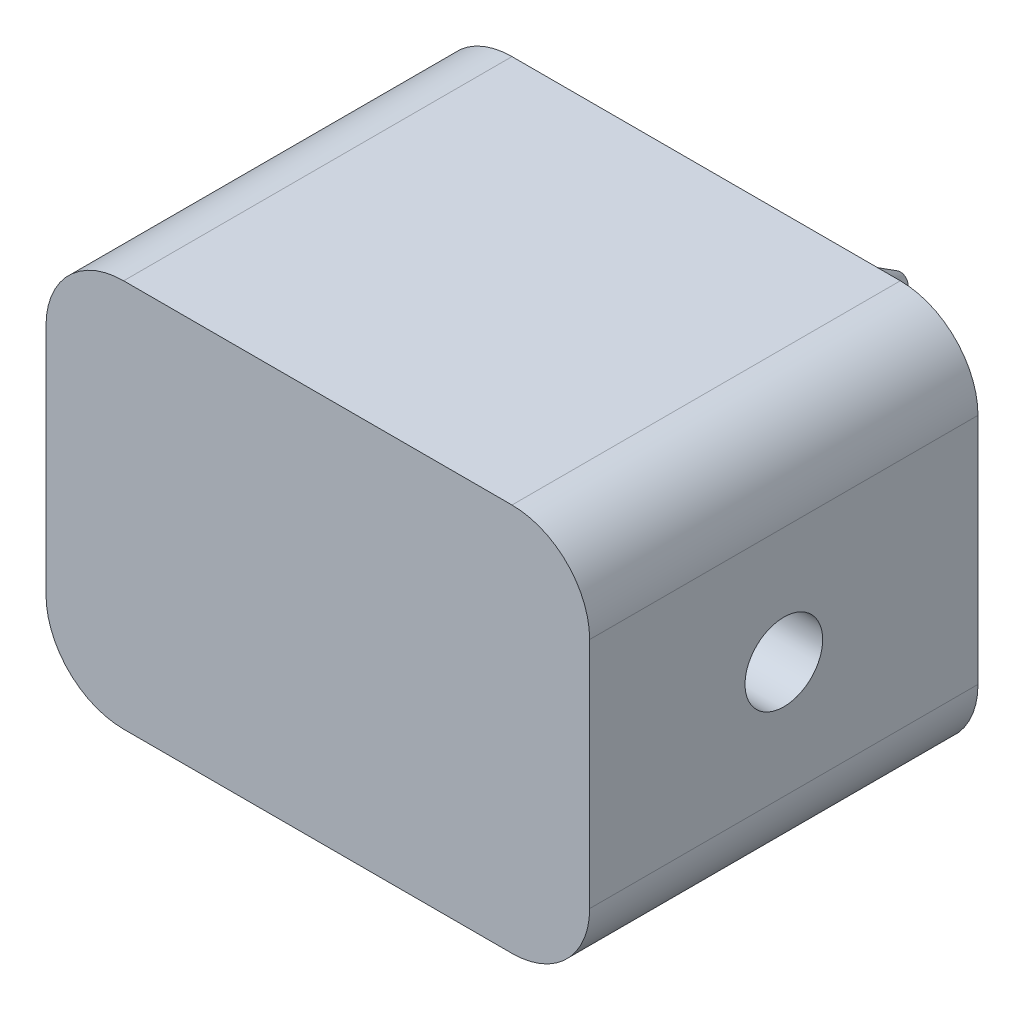
ISO-10303-21;
HEADER;
FILE_DESCRIPTION(('STEP AP214'),'2;1');
FILE_NAME('part.step','',(''),(''),'','','');
FILE_SCHEMA(('AUTOMOTIVE_DESIGN { 1 0 10303 214 1 1 1 1 }'));
ENDSEC;
DATA;
#1=APPLICATION_CONTEXT('core data for automotive mechanical design processes');
#2=APPLICATION_PROTOCOL_DEFINITION('international standard','automotive_design',2000,#1);
#3=PRODUCT_CONTEXT('',#1,'mechanical');
#4=PRODUCT('Part','Part','',(#3));
#5=PRODUCT_RELATED_PRODUCT_CATEGORY('part','',(#4));
#6=PRODUCT_DEFINITION_FORMATION('','',#4);
#7=PRODUCT_DEFINITION_CONTEXT('part definition',#1,'design');
#8=PRODUCT_DEFINITION('design','',#6,#7);
#9=PRODUCT_DEFINITION_SHAPE('','',#8);
#10=(LENGTH_UNIT() NAMED_UNIT(*) SI_UNIT(.MILLI.,.METRE.));
#11=(NAMED_UNIT(*) PLANE_ANGLE_UNIT() SI_UNIT($,.RADIAN.));
#12=(NAMED_UNIT(*) SI_UNIT($,.STERADIAN.) SOLID_ANGLE_UNIT());
#13=UNCERTAINTY_MEASURE_WITH_UNIT(LENGTH_MEASURE(1.E-05),#10,'distance_accuracy_value','');
#14=(GEOMETRIC_REPRESENTATION_CONTEXT(3) GLOBAL_UNCERTAINTY_ASSIGNED_CONTEXT((#13)) GLOBAL_UNIT_ASSIGNED_CONTEXT((#10,
#11,#12)) REPRESENTATION_CONTEXT('',''));
#15=CARTESIAN_POINT('',(0.,0.,0.));
#16=DIRECTION('',(0.,0.,1.));
#17=DIRECTION('',(1.,0.,0.));
#18=AXIS2_PLACEMENT_3D('',#15,#16,#17);
#19=CARTESIAN_POINT('',(0.,0.,50.));
#20=DIRECTION('',(1.,0.,0.));
#21=DIRECTION('',(0.,0.,-1.));
#22=AXIS2_PLACEMENT_3D('',#19,#20,#21);
#23=PLANE('',#22);
#24=CARTESIAN_POINT('',(0.,25.,25.));
#25=DIRECTION('',(1.,0.,0.));
#26=DIRECTION('',(0.,0.,-1.));
#27=AXIS2_PLACEMENT_3D('',#24,#25,#26);
#28=CIRCLE('',#27,5.);
#29=CARTESIAN_POINT('',(0.,25.,20.));
#30=VERTEX_POINT('',#29);
#31=EDGE_CURVE('E134',#30,#30,#28,.T.);
#32=ORIENTED_EDGE('',*,*,#31,.T.);
#33=EDGE_LOOP('',(#32));
#34=FACE_BOUND('',#33,.T.);
#35=DIRECTION('',(0.,-1.,0.));
#36=VECTOR('',#35,1.);
#37=CARTESIAN_POINT('',(0.,0.,0.));
#38=LINE('',#37,#36);
#39=CARTESIAN_POINT('',(0.,40.,0.));
#40=VERTEX_POINT('',#39);
#41=CARTESIAN_POINT('',(0.,10.,0.));
#42=VERTEX_POINT('',#41);
#43=EDGE_CURVE('E129',#40,#42,#38,.T.);
#44=ORIENTED_EDGE('',*,*,#43,.T.);
#45=DIRECTION('',(0.,0.,-1.));
#46=VECTOR('',#45,1.);
#47=CARTESIAN_POINT('',(0.,10.,50.));
#48=LINE('',#47,#46);
#49=CARTESIAN_POINT('',(0.,10.,50.));
#50=VERTEX_POINT('',#49);
#51=EDGE_CURVE('E106',#42,#50,#48,.F.);
#52=ORIENTED_EDGE('',*,*,#51,.T.);
#53=DIRECTION('',(0.,-1.,0.));
#54=VECTOR('',#53,1.);
#55=CARTESIAN_POINT('',(0.,0.,50.));
#56=LINE('',#55,#54);
#57=CARTESIAN_POINT('',(0.,40.,50.));
#58=VERTEX_POINT('',#57);
#59=EDGE_CURVE('E139',#58,#50,#56,.T.);
#60=ORIENTED_EDGE('',*,*,#59,.F.);
#61=DIRECTION('',(0.,0.,-1.));
#62=VECTOR('',#61,1.);
#63=CARTESIAN_POINT('',(0.,40.,50.));
#64=LINE('',#63,#62);
#65=EDGE_CURVE('E111',#58,#40,#64,.T.);
#66=ORIENTED_EDGE('',*,*,#65,.T.);
#67=EDGE_LOOP('',(#44,#52,#60,#66));
#68=FACE_BOUND('',#67,.T.);
#69=ADVANCED_FACE('F34',(#34,#68),#23,.F.);
#70=CARTESIAN_POINT('',(0.,0.,50.));
#71=DIRECTION('',(0.,1.,0.));
#72=DIRECTION('',(0.,0.,1.));
#73=AXIS2_PLACEMENT_3D('',#70,#71,#72);
#74=PLANE('',#73);
#75=DIRECTION('',(1.,0.,0.));
#76=VECTOR('',#75,1.);
#77=CARTESIAN_POINT('',(0.,0.,50.));
#78=LINE('',#77,#76);
#79=CARTESIAN_POINT('',(10.,0.,50.));
#80=VERTEX_POINT('',#79);
#81=CARTESIAN_POINT('',(60.,0.,50.));
#82=VERTEX_POINT('',#81);
#83=EDGE_CURVE('E121',#80,#82,#78,.T.);
#84=ORIENTED_EDGE('',*,*,#83,.F.);
#85=DIRECTION('',(0.,0.,-1.));
#86=VECTOR('',#85,1.);
#87=CARTESIAN_POINT('',(10.,0.,50.));
#88=LINE('',#87,#86);
#89=CARTESIAN_POINT('',(10.,0.,0.));
#90=VERTEX_POINT('',#89);
#91=EDGE_CURVE('E105',#80,#90,#88,.T.);
#92=ORIENTED_EDGE('',*,*,#91,.T.);
#93=DIRECTION('',(1.,0.,0.));
#94=VECTOR('',#93,1.);
#95=CARTESIAN_POINT('',(0.,0.,0.));
#96=LINE('',#95,#94);
#97=CARTESIAN_POINT('',(60.,0.,0.));
#98=VERTEX_POINT('',#97);
#99=EDGE_CURVE('E118',#90,#98,#96,.T.);
#100=ORIENTED_EDGE('',*,*,#99,.T.);
#101=DIRECTION('',(0.,0.,-1.));
#102=VECTOR('',#101,1.);
#103=CARTESIAN_POINT('',(60.,0.,50.));
#104=LINE('',#103,#102);
#105=EDGE_CURVE('E123',#98,#82,#104,.F.);
#106=ORIENTED_EDGE('',*,*,#105,.T.);
#107=EDGE_LOOP('',(#84,#92,#100,#106));
#108=FACE_BOUND('',#107,.T.);
#109=ADVANCED_FACE('F117',(#108),#74,.F.);
#110=CARTESIAN_POINT('',(70.,0.,50.));
#111=DIRECTION('',(-1.,0.,0.));
#112=DIRECTION('',(0.,0.,1.));
#113=AXIS2_PLACEMENT_3D('',#110,#111,#112);
#114=PLANE('',#113);
#115=CARTESIAN_POINT('',(70.,25.,25.));
#116=DIRECTION('',(1.,0.,0.));
#117=DIRECTION('',(0.,0.,-1.));
#118=AXIS2_PLACEMENT_3D('',#115,#116,#117);
#119=CIRCLE('',#118,5.);
#120=CARTESIAN_POINT('',(70.,25.,20.));
#121=VERTEX_POINT('',#120);
#122=EDGE_CURVE('E188',#121,#121,#119,.T.);
#123=ORIENTED_EDGE('',*,*,#122,.F.);
#124=EDGE_LOOP('',(#123));
#125=FACE_BOUND('',#124,.T.);
#126=DIRECTION('',(0.,1.,0.));
#127=VECTOR('',#126,1.);
#128=CARTESIAN_POINT('',(70.,0.,50.));
#129=LINE('',#128,#127);
#130=CARTESIAN_POINT('',(70.,10.,50.));
#131=VERTEX_POINT('',#130);
#132=CARTESIAN_POINT('',(70.,40.,50.));
#133=VERTEX_POINT('',#132);
#134=EDGE_CURVE('E168',#131,#133,#129,.T.);
#135=ORIENTED_EDGE('',*,*,#134,.F.);
#136=DIRECTION('',(0.,0.,-1.));
#137=VECTOR('',#136,1.);
#138=CARTESIAN_POINT('',(70.,10.,50.));
#139=LINE('',#138,#137);
#140=CARTESIAN_POINT('',(70.,10.,0.));
#141=VERTEX_POINT('',#140);
#142=EDGE_CURVE('E11',#131,#141,#139,.T.);
#143=ORIENTED_EDGE('',*,*,#142,.T.);
#144=DIRECTION('',(0.,1.,0.));
#145=VECTOR('',#144,1.);
#146=CARTESIAN_POINT('',(70.,0.,0.));
#147=LINE('',#146,#145);
#148=CARTESIAN_POINT('',(70.,40.,0.));
#149=VERTEX_POINT('',#148);
#150=EDGE_CURVE('E128',#141,#149,#147,.T.);
#151=ORIENTED_EDGE('',*,*,#150,.T.);
#152=DIRECTION('',(0.,0.,-1.));
#153=VECTOR('',#152,1.);
#154=CARTESIAN_POINT('',(70.,40.,50.));
#155=LINE('',#154,#153);
#156=EDGE_CURVE('E42',#149,#133,#155,.F.);
#157=ORIENTED_EDGE('',*,*,#156,.T.);
#158=EDGE_LOOP('',(#135,#143,#151,#157));
#159=FACE_BOUND('',#158,.T.);
#160=ADVANCED_FACE('F167',(#125,#159),#114,.F.);
#161=CARTESIAN_POINT('',(0.,50.,50.));
#162=DIRECTION('',(0.,-1.,0.));
#163=DIRECTION('',(0.,0.,-1.));
#164=AXIS2_PLACEMENT_3D('',#161,#162,#163);
#165=PLANE('',#164);
#166=DIRECTION('',(-1.,0.,0.));
#167=VECTOR('',#166,1.);
#168=CARTESIAN_POINT('',(0.,50.,0.));
#169=LINE('',#168,#167);
#170=CARTESIAN_POINT('',(60.,50.,0.));
#171=VERTEX_POINT('',#170);
#172=CARTESIAN_POINT('',(10.,50.,0.));
#173=VERTEX_POINT('',#172);
#174=EDGE_CURVE('E132',#171,#173,#169,.T.);
#175=ORIENTED_EDGE('',*,*,#174,.T.);
#176=DIRECTION('',(0.,0.,-1.));
#177=VECTOR('',#176,1.);
#178=CARTESIAN_POINT('',(10.,50.,50.));
#179=LINE('',#178,#177);
#180=CARTESIAN_POINT('',(10.,50.,50.));
#181=VERTEX_POINT('',#180);
#182=EDGE_CURVE('E49',#173,#181,#179,.F.);
#183=ORIENTED_EDGE('',*,*,#182,.T.);
#184=DIRECTION('',(-1.,0.,0.));
#185=VECTOR('',#184,1.);
#186=CARTESIAN_POINT('',(0.,50.,50.));
#187=LINE('',#186,#185);
#188=CARTESIAN_POINT('',(60.,50.,50.));
#189=VERTEX_POINT('',#188);
#190=EDGE_CURVE('E174',#189,#181,#187,.T.);
#191=ORIENTED_EDGE('',*,*,#190,.F.);
#192=DIRECTION('',(0.,0.,-1.));
#193=VECTOR('',#192,1.);
#194=CARTESIAN_POINT('',(60.,50.,50.));
#195=LINE('',#194,#193);
#196=EDGE_CURVE('E161',#189,#171,#195,.T.);
#197=ORIENTED_EDGE('',*,*,#196,.T.);
#198=EDGE_LOOP('',(#175,#183,#191,#197));
#199=FACE_BOUND('',#198,.T.);
#200=ADVANCED_FACE('F178',(#199),#165,.F.);
#201=CARTESIAN_POINT('',(0.,0.,50.));
#202=DIRECTION('',(0.,0.,-1.));
#203=DIRECTION('',(-1.,0.,0.));
#204=AXIS2_PLACEMENT_3D('',#201,#202,#203);
#205=PLANE('',#204);
#206=ORIENTED_EDGE('',*,*,#59,.T.);
#207=CARTESIAN_POINT('',(10.,10.,50.));
#208=DIRECTION('',(0.,0.,-1.));
#209=DIRECTION('',(-1.,0.,0.));
#210=AXIS2_PLACEMENT_3D('',#207,#208,#209);
#211=CIRCLE('',#210,10.);
#212=EDGE_CURVE('E159',#50,#80,#211,.F.);
#213=ORIENTED_EDGE('',*,*,#212,.T.);
#214=ORIENTED_EDGE('',*,*,#83,.T.);
#215=CARTESIAN_POINT('',(60.,10.,50.));
#216=DIRECTION('',(0.,0.,-1.));
#217=DIRECTION('',(-1.,0.,0.));
#218=AXIS2_PLACEMENT_3D('',#215,#216,#217);
#219=CIRCLE('',#218,10.);
#220=EDGE_CURVE('E155',#82,#131,#219,.F.);
#221=ORIENTED_EDGE('',*,*,#220,.T.);
#222=ORIENTED_EDGE('',*,*,#134,.T.);
#223=CARTESIAN_POINT('',(60.,40.,50.));
#224=DIRECTION('',(0.,0.,-1.));
#225=DIRECTION('',(-1.,0.,0.));
#226=AXIS2_PLACEMENT_3D('',#223,#224,#225);
#227=CIRCLE('',#226,10.);
#228=EDGE_CURVE('E56',#133,#189,#227,.F.);
#229=ORIENTED_EDGE('',*,*,#228,.T.);
#230=ORIENTED_EDGE('',*,*,#190,.T.);
#231=CARTESIAN_POINT('',(10.,40.,50.));
#232=DIRECTION('',(0.,0.,-1.));
#233=DIRECTION('',(-1.,0.,0.));
#234=AXIS2_PLACEMENT_3D('',#231,#232,#233);
#235=CIRCLE('',#234,10.);
#236=EDGE_CURVE('E157',#181,#58,#235,.F.);
#237=ORIENTED_EDGE('',*,*,#236,.T.);
#238=EDGE_LOOP('',(#206,#213,#214,#221,#222,#229,#230,#237));
#239=FACE_BOUND('',#238,.T.);
#240=ADVANCED_FACE('F172',(#239),#205,.F.);
#241=CARTESIAN_POINT('',(0.,0.,0.));
#242=DIRECTION('',(0.,0.,-1.));
#243=DIRECTION('',(-1.,0.,0.));
#244=AXIS2_PLACEMENT_3D('',#241,#242,#243);
#245=PLANE('',#244);
#246=CARTESIAN_POINT('',(35.,25.,0.));
#247=DIRECTION('',(0.,0.,-1.));
#248=DIRECTION('',(-1.,0.,0.));
#249=AXIS2_PLACEMENT_3D('',#246,#247,#248);
#250=CIRCLE('',#249,15.);
#251=CARTESIAN_POINT('',(20.,25.,0.));
#252=VERTEX_POINT('',#251);
#253=EDGE_CURVE('E144',#252,#252,#250,.T.);
#254=ORIENTED_EDGE('',*,*,#253,.F.);
#255=EDGE_LOOP('',(#254));
#256=FACE_BOUND('',#255,.T.);
#257=ORIENTED_EDGE('',*,*,#99,.F.);
#258=CARTESIAN_POINT('',(10.,10.,0.));
#259=DIRECTION('',(0.,0.,-1.));
#260=DIRECTION('',(-1.,0.,0.));
#261=AXIS2_PLACEMENT_3D('',#258,#259,#260);
#262=CIRCLE('',#261,10.);
#263=EDGE_CURVE('E101',#90,#42,#262,.T.);
#264=ORIENTED_EDGE('',*,*,#263,.T.);
#265=ORIENTED_EDGE('',*,*,#43,.F.);
#266=CARTESIAN_POINT('',(10.,40.,0.));
#267=DIRECTION('',(0.,0.,-1.));
#268=DIRECTION('',(-1.,0.,0.));
#269=AXIS2_PLACEMENT_3D('',#266,#267,#268);
#270=CIRCLE('',#269,10.);
#271=EDGE_CURVE('E112',#40,#173,#270,.T.);
#272=ORIENTED_EDGE('',*,*,#271,.T.);
#273=ORIENTED_EDGE('',*,*,#174,.F.);
#274=CARTESIAN_POINT('',(60.,40.,0.));
#275=DIRECTION('',(0.,0.,-1.));
#276=DIRECTION('',(-1.,0.,0.));
#277=AXIS2_PLACEMENT_3D('',#274,#275,#276);
#278=CIRCLE('',#277,10.);
#279=EDGE_CURVE('E122',#171,#149,#278,.T.);
#280=ORIENTED_EDGE('',*,*,#279,.T.);
#281=ORIENTED_EDGE('',*,*,#150,.F.);
#282=CARTESIAN_POINT('',(60.,10.,0.));
#283=DIRECTION('',(0.,0.,-1.));
#284=DIRECTION('',(-1.,0.,0.));
#285=AXIS2_PLACEMENT_3D('',#282,#283,#284);
#286=CIRCLE('',#285,10.);
#287=EDGE_CURVE('E127',#141,#98,#286,.T.);
#288=ORIENTED_EDGE('',*,*,#287,.T.);
#289=EDGE_LOOP('',(#257,#264,#265,#272,#273,#280,#281,#288));
#290=FACE_BOUND('',#289,.T.);
#291=ADVANCED_FACE('F125',(#256,#290),#245,.T.);
#292=CARTESIAN_POINT('',(0.,25.,25.));
#293=DIRECTION('',(1.,0.,0.));
#294=DIRECTION('',(0.,0.,-1.));
#295=AXIS2_PLACEMENT_3D('',#292,#293,#294);
#296=CYLINDRICAL_SURFACE('',#295,5.);
#297=ORIENTED_EDGE('',*,*,#31,.F.);
#298=EDGE_LOOP('',(#297));
#299=FACE_BOUND('',#298,.T.);
#300=ORIENTED_EDGE('',*,*,#122,.T.);
#301=EDGE_LOOP('',(#300));
#302=FACE_BOUND('',#301,.T.);
#303=ADVANCED_FACE('F270',(#299,#302),#296,.F.);
#304=CARTESIAN_POINT('',(35.,25.,-10.));
#305=DIRECTION('',(0.,0.,1.));
#306=DIRECTION('',(1.,0.,0.));
#307=AXIS2_PLACEMENT_3D('',#304,#305,#306);
#308=CYLINDRICAL_SURFACE('',#307,15.);
#309=CARTESIAN_POINT('',(35.,25.,-7.));
#310=DIRECTION('',(0.,0.,-1.));
#311=DIRECTION('',(-1.,0.,0.));
#312=AXIS2_PLACEMENT_3D('',#309,#310,#311);
#313=CIRCLE('',#312,15.);
#314=CARTESIAN_POINT('',(20.,25.,-7.));
#315=VERTEX_POINT('',#314);
#316=EDGE_CURVE('E143',#315,#315,#313,.F.);
#317=ORIENTED_EDGE('',*,*,#316,.T.);
#318=EDGE_LOOP('',(#317));
#319=FACE_BOUND('',#318,.T.);
#320=ORIENTED_EDGE('',*,*,#253,.T.);
#321=EDGE_LOOP('',(#320));
#322=FACE_BOUND('',#321,.T.);
#323=ADVANCED_FACE('F322',(#319,#322),#308,.T.);
#324=CARTESIAN_POINT('',(35.,25.,-10.));
#325=DIRECTION('',(0.,0.,-1.));
#326=DIRECTION('',(-1.,0.,0.));
#327=AXIS2_PLACEMENT_3D('',#324,#325,#326);
#328=PLANE('',#327);
#329=CARTESIAN_POINT('',(35.,25.,-10.));
#330=DIRECTION('',(0.,0.,-1.));
#331=DIRECTION('',(-1.,0.,0.));
#332=AXIS2_PLACEMENT_3D('',#329,#330,#331);
#333=CIRCLE('',#332,12.);
#334=CARTESIAN_POINT('',(23.,25.,-10.));
#335=VERTEX_POINT('',#334);
#336=EDGE_CURVE('E140',#335,#335,#333,.T.);
#337=ORIENTED_EDGE('',*,*,#336,.T.);
#338=EDGE_LOOP('',(#337));
#339=FACE_BOUND('',#338,.T.);
#340=CARTESIAN_POINT('',(35.,25.,-10.));
#341=DIRECTION('',(0.,0.,1.));
#342=DIRECTION('',(1.,0.,0.));
#343=AXIS2_PLACEMENT_3D('',#340,#341,#342);
#344=CIRCLE('',#343,10.);
#345=CARTESIAN_POINT('',(45.,25.,-10.));
#346=VERTEX_POINT('',#345);
#347=EDGE_CURVE('E204',#346,#346,#344,.T.);
#348=ORIENTED_EDGE('',*,*,#347,.T.);
#349=EDGE_LOOP('',(#348));
#350=FACE_BOUND('',#349,.T.);
#351=ADVANCED_FACE('F210',(#339,#350),#328,.T.);
#352=CARTESIAN_POINT('',(35.,25.,-25.));
#353=DIRECTION('',(0.,0.,1.));
#354=DIRECTION('',(1.,0.,0.));
#355=AXIS2_PLACEMENT_3D('',#352,#353,#354);
#356=PLANE('',#355);
#357=CARTESIAN_POINT('',(35.,25.,-25.));
#358=DIRECTION('',(0.,0.,1.));
#359=DIRECTION('',(1.,0.,0.));
#360=AXIS2_PLACEMENT_3D('',#357,#358,#359);
#361=CIRCLE('',#360,1.);
#362=CARTESIAN_POINT('',(36.,25.,-25.));
#363=VERTEX_POINT('',#362);
#364=EDGE_CURVE('E195',#363,#363,#361,.T.);
#365=ORIENTED_EDGE('',*,*,#364,.F.);
#366=EDGE_LOOP('',(#365));
#367=FACE_BOUND('',#366,.T.);
#368=ADVANCED_FACE('F215',(#367),#356,.F.);
#369=CARTESIAN_POINT('',(35.,25.,-25.));
#370=DIRECTION('',(0.,0.,1.));
#371=DIRECTION('',(1.,0.,0.));
#372=AXIS2_PLACEMENT_3D('',#369,#370,#371);
#373=CONICAL_SURFACE('',#372,1.,0.540419500270584);
#374=CARTESIAN_POINT('',(45.,25.,-10.));
#375=CARTESIAN_POINT('',(44.90625,25.,-10.15625));
#376=CARTESIAN_POINT('',(44.8125,25.,-10.3125));
#377=CARTESIAN_POINT('',(44.625,25.,-10.625));
#378=CARTESIAN_POINT('',(44.53125,25.,-10.78125));
#379=CARTESIAN_POINT('',(44.34375,25.,-11.09375));
#380=CARTESIAN_POINT('',(44.25,25.,-11.25));
#381=CARTESIAN_POINT('',(44.0625,25.,-11.5625));
#382=CARTESIAN_POINT('',(43.96875,25.,-11.71875));
#383=CARTESIAN_POINT('',(43.78125,25.,-12.03125));
#384=CARTESIAN_POINT('',(43.6875,25.,-12.1875));
#385=CARTESIAN_POINT('',(43.5,25.,-12.5));
#386=CARTESIAN_POINT('',(43.40625,25.,-12.65625));
#387=CARTESIAN_POINT('',(43.21875,25.,-12.96875));
#388=CARTESIAN_POINT('',(43.125,25.,-13.125));
#389=CARTESIAN_POINT('',(42.9375,25.,-13.4375));
#390=CARTESIAN_POINT('',(42.84375,25.,-13.59375));
#391=CARTESIAN_POINT('',(42.65625,25.,-13.90625));
#392=CARTESIAN_POINT('',(42.5625,25.,-14.0625));
#393=CARTESIAN_POINT('',(42.375,25.,-14.375));
#394=CARTESIAN_POINT('',(42.28125,25.,-14.53125));
#395=CARTESIAN_POINT('',(42.09375,25.,-14.84375));
#396=CARTESIAN_POINT('',(42.,25.,-15.));
#397=CARTESIAN_POINT('',(41.8125,25.,-15.3125));
#398=CARTESIAN_POINT('',(41.71875,25.,-15.46875));
#399=CARTESIAN_POINT('',(41.53125,25.,-15.78125));
#400=CARTESIAN_POINT('',(41.4375,25.,-15.9375));
#401=CARTESIAN_POINT('',(41.25,25.,-16.25));
#402=CARTESIAN_POINT('',(41.15625,25.,-16.40625));
#403=CARTESIAN_POINT('',(40.96875,25.,-16.71875));
#404=CARTESIAN_POINT('',(40.875,25.,-16.875));
#405=CARTESIAN_POINT('',(40.6875,25.,-17.1875));
#406=CARTESIAN_POINT('',(40.59375,25.,-17.34375));
#407=CARTESIAN_POINT('',(40.40625,25.,-17.65625));
#408=CARTESIAN_POINT('',(40.3125,25.,-17.8125));
#409=CARTESIAN_POINT('',(40.125,25.,-18.125));
#410=CARTESIAN_POINT('',(40.03125,25.,-18.28125));
#411=CARTESIAN_POINT('',(39.84375,25.,-18.59375));
#412=CARTESIAN_POINT('',(39.75,25.,-18.75));
#413=CARTESIAN_POINT('',(39.5625,25.,-19.0625));
#414=CARTESIAN_POINT('',(39.46875,25.,-19.21875));
#415=CARTESIAN_POINT('',(39.28125,25.,-19.53125));
#416=CARTESIAN_POINT('',(39.1875,25.,-19.6875));
#417=CARTESIAN_POINT('',(39.,25.,-20.));
#418=CARTESIAN_POINT('',(38.90625,25.,-20.15625));
#419=CARTESIAN_POINT('',(38.71875,25.,-20.46875));
#420=CARTESIAN_POINT('',(38.625,25.,-20.625));
#421=CARTESIAN_POINT('',(38.4375,25.,-20.9375));
#422=CARTESIAN_POINT('',(38.34375,25.,-21.09375));
#423=CARTESIAN_POINT('',(38.15625,25.,-21.40625));
#424=CARTESIAN_POINT('',(38.0625,25.,-21.5625));
#425=CARTESIAN_POINT('',(37.875,25.,-21.875));
#426=CARTESIAN_POINT('',(37.78125,25.,-22.03125));
#427=CARTESIAN_POINT('',(37.59375,25.,-22.34375));
#428=CARTESIAN_POINT('',(37.5,25.,-22.5));
#429=CARTESIAN_POINT('',(37.3125,25.,-22.8125));
#430=CARTESIAN_POINT('',(37.21875,25.,-22.96875));
#431=CARTESIAN_POINT('',(37.03125,25.,-23.28125));
#432=CARTESIAN_POINT('',(36.9375,25.,-23.4375));
#433=CARTESIAN_POINT('',(36.75,25.,-23.75));
#434=CARTESIAN_POINT('',(36.65625,25.,-23.90625));
#435=CARTESIAN_POINT('',(36.46875,25.,-24.21875));
#436=CARTESIAN_POINT('',(36.375,25.,-24.375));
#437=CARTESIAN_POINT('',(36.1875,25.,-24.6875));
#438=CARTESIAN_POINT('',(36.09375,25.,-24.84375));
#439=CARTESIAN_POINT('',(36.,25.,-25.));
#440=B_SPLINE_CURVE_WITH_KNOTS('',3,(#374,#375,#376,#377,#378,#379,#380,#381,#382,#383,#384,
#385,#386,#387,#388,#389,#390,#391,#392,#393,#394,#395,#396,#397,#398,#399,#400,#401,#402,#403,
#404,#405,#406,#407,#408,#409,#410,#411,#412,#413,#414,#415,#416,#417,#418,#419,#420,#421,#422,
#423,#424,#425,#426,#427,#428,#429,#430,#431,#432,#433,#434,#435,#436,#437,#438,#439),
.UNSPECIFIED.,.F.,.F.,(4,2,2,2,2,2,2,2,2,2,2,2,2,2,2,2,2,2,2,2,2,2,2,2,2,2,2,2,2,2,2,2,4),(0.,
0.546651740141749,1.09330348028349,1.63995522042524,2.18660696056699,2.73325870070874,
3.27991044085048,3.82656218099223,4.37321392113398,4.91986566127572,5.46651740141747,
6.01316914155922,6.55982088170097,7.10647262184271,7.65312436198446,8.19977610212621,
8.74642784226795,9.2930795824097,9.83973132255145,10.3863830626932,10.9330348028349,
11.4796865429767,12.0263382831184,12.5729900232602,13.1196417634019,13.6662935035437,
14.2129452436854,14.7595969838272,15.3062487239689,15.8529004641107,16.3995522042524,
16.9462039443942,17.4928556845359),.UNSPECIFIED.);
#441=EDGE_CURVE('BSEAM212',#346,#363,#440,.T.);
#442=ORIENTED_EDGE('',*,*,#347,.F.);
#443=ORIENTED_EDGE('',*,*,#364,.T.);
#444=ORIENTED_EDGE('',*,*,#441,.T.);
#445=ORIENTED_EDGE('',*,*,#441,.F.);
#446=EDGE_LOOP('',(#442,#444,#443,#445));
#447=FACE_BOUND('',#446,.T.);
#448=ADVANCED_FACE('F212',(#447),#373,.T.);
#449=CARTESIAN_POINT('',(35.,25.,-7.));
#450=DIRECTION('',(0.,0.,-1.));
#451=DIRECTION('',(-1.,0.,0.));
#452=AXIS2_PLACEMENT_3D('',#449,#450,#451);
#453=TOROIDAL_SURFACE('',#452,12.,3.);
#454=ORIENTED_EDGE('',*,*,#316,.F.);
#455=EDGE_LOOP('',(#454));
#456=FACE_BOUND('',#455,.T.);
#457=ORIENTED_EDGE('',*,*,#336,.F.);
#458=EDGE_LOOP('',(#457));
#459=FACE_BOUND('',#458,.T.);
#460=ADVANCED_FACE('F214',(#456,#459),#453,.T.);
#461=CARTESIAN_POINT('',(10.,10.,50.));
#462=DIRECTION('',(0.,0.,-1.));
#463=DIRECTION('',(-1.,0.,0.));
#464=AXIS2_PLACEMENT_3D('',#461,#462,#463);
#465=CYLINDRICAL_SURFACE('',#464,10.);
#466=ORIENTED_EDGE('',*,*,#212,.F.);
#467=ORIENTED_EDGE('',*,*,#51,.F.);
#468=ORIENTED_EDGE('',*,*,#263,.F.);
#469=ORIENTED_EDGE('',*,*,#91,.F.);
#470=EDGE_LOOP('',(#466,#467,#468,#469));
#471=FACE_BOUND('',#470,.T.);
#472=ADVANCED_FACE('F104',(#471),#465,.T.);
#473=CARTESIAN_POINT('',(10.,40.,50.));
#474=DIRECTION('',(0.,0.,-1.));
#475=DIRECTION('',(-1.,0.,0.));
#476=AXIS2_PLACEMENT_3D('',#473,#474,#475);
#477=CYLINDRICAL_SURFACE('',#476,10.);
#478=ORIENTED_EDGE('',*,*,#236,.F.);
#479=ORIENTED_EDGE('',*,*,#182,.F.);
#480=ORIENTED_EDGE('',*,*,#271,.F.);
#481=ORIENTED_EDGE('',*,*,#65,.F.);
#482=EDGE_LOOP('',(#478,#479,#480,#481));
#483=FACE_BOUND('',#482,.T.);
#484=ADVANCED_FACE('F182',(#483),#477,.T.);
#485=CARTESIAN_POINT('',(60.,10.,50.));
#486=DIRECTION('',(0.,0.,-1.));
#487=DIRECTION('',(-1.,0.,0.));
#488=AXIS2_PLACEMENT_3D('',#485,#486,#487);
#489=CYLINDRICAL_SURFACE('',#488,10.);
#490=ORIENTED_EDGE('',*,*,#220,.F.);
#491=ORIENTED_EDGE('',*,*,#105,.F.);
#492=ORIENTED_EDGE('',*,*,#287,.F.);
#493=ORIENTED_EDGE('',*,*,#142,.F.);
#494=EDGE_LOOP('',(#490,#491,#492,#493));
#495=FACE_BOUND('',#494,.T.);
#496=ADVANCED_FACE('F236',(#495),#489,.T.);
#497=CARTESIAN_POINT('',(60.,40.,50.));
#498=DIRECTION('',(0.,0.,-1.));
#499=DIRECTION('',(-1.,0.,0.));
#500=AXIS2_PLACEMENT_3D('',#497,#498,#499);
#501=CYLINDRICAL_SURFACE('',#500,10.);
#502=ORIENTED_EDGE('',*,*,#228,.F.);
#503=ORIENTED_EDGE('',*,*,#156,.F.);
#504=ORIENTED_EDGE('',*,*,#279,.F.);
#505=ORIENTED_EDGE('',*,*,#196,.F.);
#506=EDGE_LOOP('',(#502,#503,#504,#505));
#507=FACE_BOUND('',#506,.T.);
#508=ADVANCED_FACE('F36',(#507),#501,.T.);
#509=CLOSED_SHELL('',(#69,#109,#160,#200,#240,#291,#303,#323,#351,#368,#448,#460,#472,#484,#496,#508));
#510=MANIFOLD_SOLID_BREP('B2',#509);
#511=ADVANCED_BREP_SHAPE_REPRESENTATION('',(#18,#510),#14);
#512=SHAPE_DEFINITION_REPRESENTATION(#9,#511);
ENDSEC;
END-ISO-10303-21;
